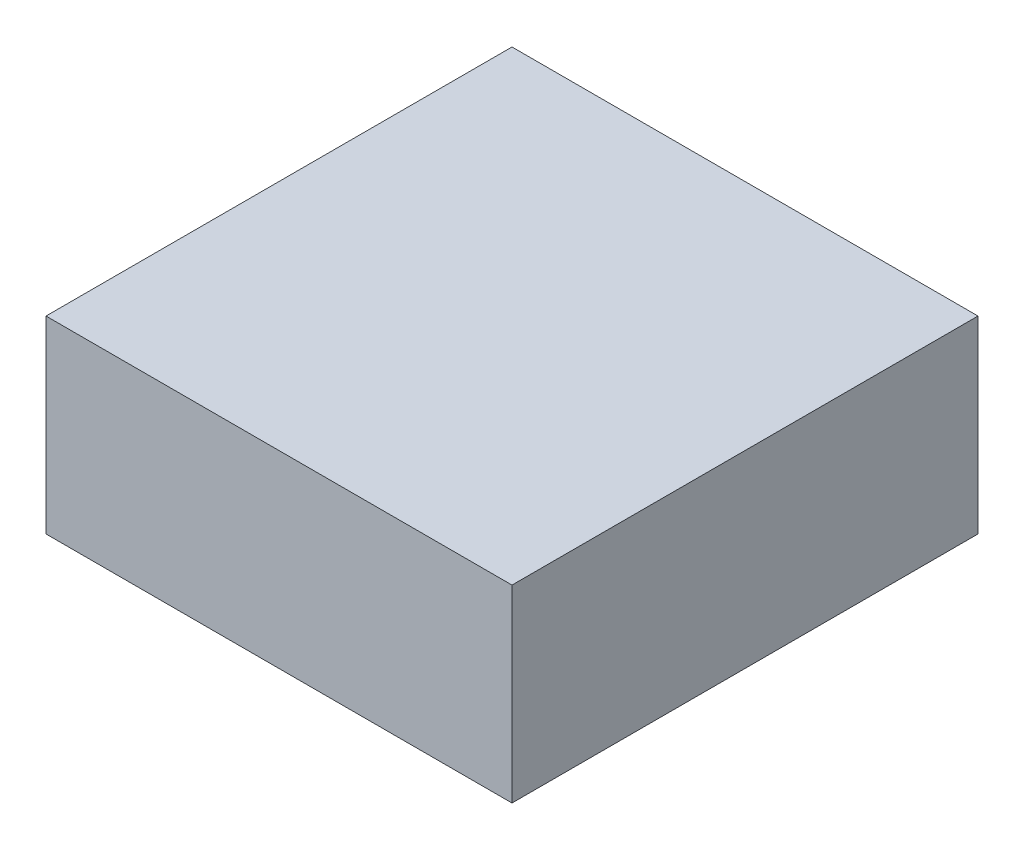
ISO-10303-21;
HEADER;
FILE_DESCRIPTION(('STEP AP214'),'2;1');
FILE_NAME('part.step','',(''),(''),'','','');
FILE_SCHEMA(('AUTOMOTIVE_DESIGN { 1 0 10303 214 1 1 1 1 }'));
ENDSEC;
DATA;
#1=APPLICATION_CONTEXT('core data for automotive mechanical design processes');
#2=APPLICATION_PROTOCOL_DEFINITION('international standard','automotive_design',2000,#1);
#3=PRODUCT_CONTEXT('',#1,'mechanical');
#4=PRODUCT('Part','Part','',(#3));
#5=PRODUCT_RELATED_PRODUCT_CATEGORY('part','',(#4));
#6=PRODUCT_DEFINITION_FORMATION('','',#4);
#7=PRODUCT_DEFINITION_CONTEXT('part definition',#1,'design');
#8=PRODUCT_DEFINITION('design','',#6,#7);
#9=PRODUCT_DEFINITION_SHAPE('','',#8);
#10=(LENGTH_UNIT() NAMED_UNIT(*) SI_UNIT(.MILLI.,.METRE.));
#11=(NAMED_UNIT(*) PLANE_ANGLE_UNIT() SI_UNIT($,.RADIAN.));
#12=(NAMED_UNIT(*) SI_UNIT($,.STERADIAN.) SOLID_ANGLE_UNIT());
#13=UNCERTAINTY_MEASURE_WITH_UNIT(LENGTH_MEASURE(1.E-05),#10,'distance_accuracy_value','');
#14=(GEOMETRIC_REPRESENTATION_CONTEXT(3) GLOBAL_UNCERTAINTY_ASSIGNED_CONTEXT((#13)) GLOBAL_UNIT_ASSIGNED_CONTEXT((#10,
#11,#12)) REPRESENTATION_CONTEXT('',''));
#15=CARTESIAN_POINT('',(0.,0.,0.));
#16=DIRECTION('',(0.,0.,1.));
#17=DIRECTION('',(1.,0.,0.));
#18=AXIS2_PLACEMENT_3D('',#15,#16,#17);
#19=CARTESIAN_POINT('',(1.88196721311474,0.,7.9));
#20=DIRECTION('',(1.,0.,0.));
#21=DIRECTION('',(0.,0.,-1.));
#22=AXIS2_PLACEMENT_3D('',#19,#20,#21);
#23=PLANE('',#22);
#24=DIRECTION('',(0.,0.,-1.));
#25=VECTOR('',#24,1.);
#26=CARTESIAN_POINT('',(1.88196721311474,0.,7.9));
#27=LINE('',#26,#25);
#28=CARTESIAN_POINT('',(1.88196721311474,0.,6.7));
#29=VERTEX_POINT('',#28);
#30=CARTESIAN_POINT('',(1.88196721311474,0.,1.19113572487986));
#31=VERTEX_POINT('',#30);
#32=EDGE_CURVE('E136',#29,#31,#27,.T.);
#33=ORIENTED_EDGE('',*,*,#32,.T.);
#34=DIRECTION('',(0.,1.,0.));
#35=VECTOR('',#34,1.);
#36=CARTESIAN_POINT('',(1.88196721311474,0.,1.19113572487986));
#37=LINE('',#36,#35);
#38=CARTESIAN_POINT('',(1.88196721311474,2.,1.19113572487986));
#39=VERTEX_POINT('',#38);
#40=EDGE_CURVE('E113',#31,#39,#37,.T.);
#41=ORIENTED_EDGE('',*,*,#40,.T.);
#42=DIRECTION('',(0.,0.,-1.));
#43=VECTOR('',#42,1.);
#44=CARTESIAN_POINT('',(1.88196721311474,2.,7.9));
#45=LINE('',#44,#43);
#46=CARTESIAN_POINT('',(1.88196721311474,2.,6.7));
#47=VERTEX_POINT('',#46);
#48=EDGE_CURVE('E165',#47,#39,#45,.T.);
#49=ORIENTED_EDGE('',*,*,#48,.F.);
#50=DIRECTION('',(0.,-1.,0.));
#51=VECTOR('',#50,1.);
#52=CARTESIAN_POINT('',(1.88196721311474,0.,6.7));
#53=LINE('',#52,#51);
#54=EDGE_CURVE('E64',#47,#29,#53,.T.);
#55=ORIENTED_EDGE('',*,*,#54,.T.);
#56=EDGE_LOOP('',(#33,#41,#49,#55));
#57=FACE_BOUND('',#56,.T.);
#58=ADVANCED_FACE('F41',(#57),#23,.T.);
#59=CARTESIAN_POINT('',(7.38196721311474,0.,7.9));
#60=DIRECTION('',(-1.,0.,0.));
#61=DIRECTION('',(0.,0.,1.));
#62=AXIS2_PLACEMENT_3D('',#59,#60,#61);
#63=PLANE('',#62);
#64=DIRECTION('',(0.,0.,-1.));
#65=VECTOR('',#64,1.);
#66=CARTESIAN_POINT('',(7.38196721311474,2.,7.9));
#67=LINE('',#66,#65);
#68=CARTESIAN_POINT('',(7.38196721311474,2.,6.7));
#69=VERTEX_POINT('',#68);
#70=CARTESIAN_POINT('',(7.38196721311474,2.,1.19113572487986));
#71=VERTEX_POINT('',#70);
#72=EDGE_CURVE('E168',#69,#71,#67,.T.);
#73=ORIENTED_EDGE('',*,*,#72,.T.);
#74=DIRECTION('',(0.,1.,0.));
#75=VECTOR('',#74,1.);
#76=CARTESIAN_POINT('',(7.38196721311474,0.,1.19113572487986));
#77=LINE('',#76,#75);
#78=CARTESIAN_POINT('',(7.38196721311474,0.,1.19113572487986));
#79=VERTEX_POINT('',#78);
#80=EDGE_CURVE('E162',#79,#71,#77,.T.);
#81=ORIENTED_EDGE('',*,*,#80,.F.);
#82=DIRECTION('',(0.,0.,-1.));
#83=VECTOR('',#82,1.);
#84=CARTESIAN_POINT('',(7.38196721311474,0.,7.9));
#85=LINE('',#84,#83);
#86=CARTESIAN_POINT('',(7.38196721311474,0.,6.7));
#87=VERTEX_POINT('',#86);
#88=EDGE_CURVE('E138',#87,#79,#85,.T.);
#89=ORIENTED_EDGE('',*,*,#88,.F.);
#90=DIRECTION('',(0.,1.,0.));
#91=VECTOR('',#90,1.);
#92=CARTESIAN_POINT('',(7.38196721311474,0.,6.7));
#93=LINE('',#92,#91);
#94=EDGE_CURVE('E171',#87,#69,#93,.T.);
#95=ORIENTED_EDGE('',*,*,#94,.T.);
#96=EDGE_LOOP('',(#73,#81,#89,#95));
#97=FACE_BOUND('',#96,.T.);
#98=ADVANCED_FACE('F181',(#97),#63,.T.);
#99=CARTESIAN_POINT('',(0.681967213114738,2.,7.9));
#100=DIRECTION('',(0.,-1.,0.));
#101=DIRECTION('',(1.,0.,0.));
#102=AXIS2_PLACEMENT_3D('',#99,#100,#101);
#103=PLANE('',#102);
#104=ORIENTED_EDGE('',*,*,#48,.T.);
#105=DIRECTION('',(-1.,0.,0.));
#106=VECTOR('',#105,1.);
#107=CARTESIAN_POINT('',(1.88196721311474,2.,1.19113572487986));
#108=LINE('',#107,#106);
#109=EDGE_CURVE('E156',#71,#39,#108,.T.);
#110=ORIENTED_EDGE('',*,*,#109,.F.);
#111=ORIENTED_EDGE('',*,*,#72,.F.);
#112=DIRECTION('',(-1.,0.,0.));
#113=VECTOR('',#112,1.);
#114=CARTESIAN_POINT('',(0.,2.,6.7));
#115=LINE('',#114,#113);
#116=EDGE_CURVE('E169',#69,#47,#115,.T.);
#117=ORIENTED_EDGE('',*,*,#116,.T.);
#118=EDGE_LOOP('',(#104,#110,#111,#117));
#119=FACE_BOUND('',#118,.T.);
#120=ADVANCED_FACE('F187',(#119),#103,.T.);
#121=CARTESIAN_POINT('',(0.681967213114738,0.,7.9));
#122=DIRECTION('',(0.,1.,0.));
#123=DIRECTION('',(0.,0.,1.));
#124=AXIS2_PLACEMENT_3D('',#121,#122,#123);
#125=PLANE('',#124);
#126=DIRECTION('',(0.,0.,-1.));
#127=VECTOR('',#126,1.);
#128=CARTESIAN_POINT('',(0.681967213114738,0.,7.9));
#129=LINE('',#128,#127);
#130=CARTESIAN_POINT('',(0.681967213114738,0.,7.9));
#131=VERTEX_POINT('',#130);
#132=CARTESIAN_POINT('',(0.681967213114738,0.,0.));
#133=VERTEX_POINT('',#132);
#134=EDGE_CURVE('E11',#131,#133,#129,.T.);
#135=ORIENTED_EDGE('',*,*,#134,.T.);
#136=DIRECTION('',(1.,0.,0.));
#137=VECTOR('',#136,1.);
#138=CARTESIAN_POINT('',(7.38196721311474,0.,0.));
#139=LINE('',#138,#137);
#140=CARTESIAN_POINT('',(8.58196721311474,0.,0.));
#141=VERTEX_POINT('',#140);
#142=EDGE_CURVE('E106',#133,#141,#139,.T.);
#143=ORIENTED_EDGE('',*,*,#142,.T.);
#144=DIRECTION('',(0.,0.,-1.));
#145=VECTOR('',#144,1.);
#146=CARTESIAN_POINT('',(8.58196721311474,0.,7.9));
#147=LINE('',#146,#145);
#148=CARTESIAN_POINT('',(8.58196721311474,0.,7.9));
#149=VERTEX_POINT('',#148);
#150=EDGE_CURVE('E49',#149,#141,#147,.T.);
#151=ORIENTED_EDGE('',*,*,#150,.F.);
#152=DIRECTION('',(1.,0.,0.));
#153=VECTOR('',#152,1.);
#154=CARTESIAN_POINT('',(0.681967213114738,0.,7.9));
#155=LINE('',#154,#153);
#156=EDGE_CURVE('E126',#131,#149,#155,.T.);
#157=ORIENTED_EDGE('',*,*,#156,.F.);
#158=EDGE_LOOP('',(#135,#143,#151,#157));
#159=FACE_BOUND('',#158,.T.);
#160=DIRECTION('',(-1.,0.,0.));
#161=VECTOR('',#160,1.);
#162=CARTESIAN_POINT('',(1.88196721311474,0.,1.19113572487986));
#163=LINE('',#162,#161);
#164=EDGE_CURVE('E114',#79,#31,#163,.T.);
#165=ORIENTED_EDGE('',*,*,#164,.T.);
#166=ORIENTED_EDGE('',*,*,#32,.F.);
#167=DIRECTION('',(1.,0.,0.));
#168=VECTOR('',#167,1.);
#169=CARTESIAN_POINT('',(0.,0.,6.7));
#170=LINE('',#169,#168);
#171=EDGE_CURVE('E141',#29,#87,#170,.T.);
#172=ORIENTED_EDGE('',*,*,#171,.T.);
#173=ORIENTED_EDGE('',*,*,#88,.T.);
#174=EDGE_LOOP('',(#165,#166,#172,#173));
#175=FACE_BOUND('',#174,.T.);
#176=ADVANCED_FACE('F124',(#159,#175),#125,.F.);
#177=CARTESIAN_POINT('',(0.681967213114738,0.,7.9));
#178=DIRECTION('',(1.,0.,0.));
#179=DIRECTION('',(0.,0.,-1.));
#180=AXIS2_PLACEMENT_3D('',#177,#178,#179);
#181=PLANE('',#180);
#182=DIRECTION('',(0.,0.,-1.));
#183=VECTOR('',#182,1.);
#184=CARTESIAN_POINT('',(0.681967213114738,3.2,7.9));
#185=LINE('',#184,#183);
#186=CARTESIAN_POINT('',(0.681967213114738,3.2,7.9));
#187=VERTEX_POINT('',#186);
#188=CARTESIAN_POINT('',(0.681967213114738,3.2,0.));
#189=VERTEX_POINT('',#188);
#190=EDGE_CURVE('E121',#187,#189,#185,.T.);
#191=ORIENTED_EDGE('',*,*,#190,.T.);
#192=DIRECTION('',(0.,-1.,0.));
#193=VECTOR('',#192,1.);
#194=CARTESIAN_POINT('',(0.681967213114738,3.2,0.));
#195=LINE('',#194,#193);
#196=EDGE_CURVE('E56',#189,#133,#195,.T.);
#197=ORIENTED_EDGE('',*,*,#196,.T.);
#198=ORIENTED_EDGE('',*,*,#134,.F.);
#199=DIRECTION('',(0.,-1.,0.));
#200=VECTOR('',#199,1.);
#201=CARTESIAN_POINT('',(0.681967213114738,0.,7.9));
#202=LINE('',#201,#200);
#203=EDGE_CURVE('E131',#187,#131,#202,.T.);
#204=ORIENTED_EDGE('',*,*,#203,.F.);
#205=EDGE_LOOP('',(#191,#197,#198,#204));
#206=FACE_BOUND('',#205,.T.);
#207=ADVANCED_FACE('F43',(#206),#181,.F.);
#208=CARTESIAN_POINT('',(8.58196721311474,0.,7.9));
#209=DIRECTION('',(-1.,0.,0.));
#210=DIRECTION('',(0.,0.,1.));
#211=AXIS2_PLACEMENT_3D('',#208,#209,#210);
#212=PLANE('',#211);
#213=ORIENTED_EDGE('',*,*,#150,.T.);
#214=DIRECTION('',(0.,-1.,0.));
#215=VECTOR('',#214,1.);
#216=CARTESIAN_POINT('',(8.58196721311474,3.2,0.));
#217=LINE('',#216,#215);
#218=CARTESIAN_POINT('',(8.58196721311474,3.2,0.));
#219=VERTEX_POINT('',#218);
#220=EDGE_CURVE('E109',#219,#141,#217,.T.);
#221=ORIENTED_EDGE('',*,*,#220,.F.);
#222=DIRECTION('',(0.,0.,-1.));
#223=VECTOR('',#222,1.);
#224=CARTESIAN_POINT('',(8.58196721311474,3.2,7.9));
#225=LINE('',#224,#223);
#226=CARTESIAN_POINT('',(8.58196721311474,3.2,7.9));
#227=VERTEX_POINT('',#226);
#228=EDGE_CURVE('E147',#227,#219,#225,.T.);
#229=ORIENTED_EDGE('',*,*,#228,.F.);
#230=DIRECTION('',(0.,1.,0.));
#231=VECTOR('',#230,1.);
#232=CARTESIAN_POINT('',(8.58196721311474,0.,7.9));
#233=LINE('',#232,#231);
#234=EDGE_CURVE('E130',#149,#227,#233,.T.);
#235=ORIENTED_EDGE('',*,*,#234,.F.);
#236=EDGE_LOOP('',(#213,#221,#229,#235));
#237=FACE_BOUND('',#236,.T.);
#238=ADVANCED_FACE('F150',(#237),#212,.F.);
#239=CARTESIAN_POINT('',(0.681967213114738,3.2,7.9));
#240=DIRECTION('',(0.,-1.,0.));
#241=DIRECTION('',(1.,0.,0.));
#242=AXIS2_PLACEMENT_3D('',#239,#240,#241);
#243=PLANE('',#242);
#244=ORIENTED_EDGE('',*,*,#228,.T.);
#245=DIRECTION('',(-1.,0.,0.));
#246=VECTOR('',#245,1.);
#247=CARTESIAN_POINT('',(0.681967213114738,3.2,0.));
#248=LINE('',#247,#246);
#249=EDGE_CURVE('E122',#219,#189,#248,.T.);
#250=ORIENTED_EDGE('',*,*,#249,.T.);
#251=ORIENTED_EDGE('',*,*,#190,.F.);
#252=DIRECTION('',(-1.,0.,0.));
#253=VECTOR('',#252,1.);
#254=CARTESIAN_POINT('',(0.681967213114738,3.2,7.9));
#255=LINE('',#254,#253);
#256=EDGE_CURVE('E135',#227,#187,#255,.T.);
#257=ORIENTED_EDGE('',*,*,#256,.F.);
#258=EDGE_LOOP('',(#244,#250,#251,#257));
#259=FACE_BOUND('',#258,.T.);
#260=ADVANCED_FACE('F153',(#259),#243,.F.);
#261=CARTESIAN_POINT('',(0.,0.,7.9));
#262=DIRECTION('',(0.,0.,-1.));
#263=DIRECTION('',(-1.,0.,0.));
#264=AXIS2_PLACEMENT_3D('',#261,#262,#263);
#265=PLANE('',#264);
#266=ORIENTED_EDGE('',*,*,#203,.T.);
#267=ORIENTED_EDGE('',*,*,#156,.T.);
#268=ORIENTED_EDGE('',*,*,#234,.T.);
#269=ORIENTED_EDGE('',*,*,#256,.T.);
#270=EDGE_LOOP('',(#266,#267,#268,#269));
#271=FACE_BOUND('',#270,.T.);
#272=ADVANCED_FACE('F133',(#271),#265,.F.);
#273=CARTESIAN_POINT('',(0.,0.,6.7));
#274=DIRECTION('',(0.,0.,-1.));
#275=DIRECTION('',(-1.,0.,0.));
#276=AXIS2_PLACEMENT_3D('',#273,#274,#275);
#277=PLANE('',#276);
#278=ORIENTED_EDGE('',*,*,#54,.F.);
#279=ORIENTED_EDGE('',*,*,#116,.F.);
#280=ORIENTED_EDGE('',*,*,#94,.F.);
#281=ORIENTED_EDGE('',*,*,#171,.F.);
#282=EDGE_LOOP('',(#278,#279,#280,#281));
#283=FACE_BOUND('',#282,.T.);
#284=ADVANCED_FACE('F185',(#283),#277,.T.);
#285=CARTESIAN_POINT('',(1.88196721311474,0.,1.19113572487986));
#286=DIRECTION('',(0.,0.,-1.));
#287=DIRECTION('',(-1.,0.,0.));
#288=AXIS2_PLACEMENT_3D('',#285,#286,#287);
#289=PLANE('',#288);
#290=ORIENTED_EDGE('',*,*,#109,.T.);
#291=ORIENTED_EDGE('',*,*,#40,.F.);
#292=ORIENTED_EDGE('',*,*,#164,.F.);
#293=ORIENTED_EDGE('',*,*,#80,.T.);
#294=EDGE_LOOP('',(#290,#291,#292,#293));
#295=FACE_BOUND('',#294,.T.);
#296=ADVANCED_FACE('F190',(#295),#289,.F.);
#297=CARTESIAN_POINT('',(7.38196721311474,0.,0.));
#298=DIRECTION('',(0.,0.,1.));
#299=DIRECTION('',(1.,0.,0.));
#300=AXIS2_PLACEMENT_3D('',#297,#298,#299);
#301=PLANE('',#300);
#302=ORIENTED_EDGE('',*,*,#142,.F.);
#303=ORIENTED_EDGE('',*,*,#196,.F.);
#304=ORIENTED_EDGE('',*,*,#249,.F.);
#305=ORIENTED_EDGE('',*,*,#220,.T.);
#306=EDGE_LOOP('',(#302,#303,#304,#305));
#307=FACE_BOUND('',#306,.T.);
#308=ADVANCED_FACE('F107',(#307),#301,.F.);
#309=CLOSED_SHELL('',(#58,#98,#120,#176,#207,#238,#260,#272,#284,#296,#308));
#310=MANIFOLD_SOLID_BREP('B2',#309);
#311=ADVANCED_BREP_SHAPE_REPRESENTATION('',(#18,#310),#14);
#312=SHAPE_DEFINITION_REPRESENTATION(#9,#311);
ENDSEC;
END-ISO-10303-21;
